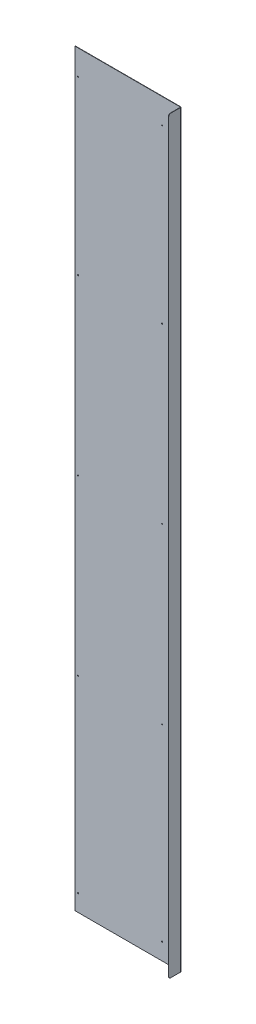
ISO-10303-21;
HEADER;
FILE_DESCRIPTION(('STEP AP214'),'2;1');
FILE_NAME('part.step','',(''),(''),'','','');
FILE_SCHEMA(('AUTOMOTIVE_DESIGN { 1 0 10303 214 1 1 1 1 }'));
ENDSEC;
DATA;
#1=APPLICATION_CONTEXT('core data for automotive mechanical design processes');
#2=APPLICATION_PROTOCOL_DEFINITION('international standard','automotive_design',2000,#1);
#3=PRODUCT_CONTEXT('',#1,'mechanical');
#4=PRODUCT('Part','Part','',(#3));
#5=PRODUCT_RELATED_PRODUCT_CATEGORY('part','',(#4));
#6=PRODUCT_DEFINITION_FORMATION('','',#4);
#7=PRODUCT_DEFINITION_CONTEXT('part definition',#1,'design');
#8=PRODUCT_DEFINITION('design','',#6,#7);
#9=PRODUCT_DEFINITION_SHAPE('','',#8);
#10=(LENGTH_UNIT() NAMED_UNIT(*) SI_UNIT(.MILLI.,.METRE.));
#11=(NAMED_UNIT(*) PLANE_ANGLE_UNIT() SI_UNIT($,.RADIAN.));
#12=(NAMED_UNIT(*) SI_UNIT($,.STERADIAN.) SOLID_ANGLE_UNIT());
#13=UNCERTAINTY_MEASURE_WITH_UNIT(LENGTH_MEASURE(1.E-05),#10,'distance_accuracy_value','');
#14=(GEOMETRIC_REPRESENTATION_CONTEXT(3) GLOBAL_UNCERTAINTY_ASSIGNED_CONTEXT((#13)) GLOBAL_UNIT_ASSIGNED_CONTEXT((#10,
#11,#12)) REPRESENTATION_CONTEXT('',''));
#15=CARTESIAN_POINT('',(0.,0.,0.));
#16=DIRECTION('',(0.,0.,1.));
#17=DIRECTION('',(1.,0.,0.));
#18=AXIS2_PLACEMENT_3D('',#15,#16,#17);
#19=CARTESIAN_POINT('',(312.642213333332,-25.,408.));
#20=DIRECTION('',(-1.,0.,0.));
#21=DIRECTION('',(0.,1.,0.));
#22=AXIS2_PLACEMENT_3D('',#19,#20,#21);
#23=PLANE('',#22);
#24=DIRECTION('',(0.,-1.,0.));
#25=VECTOR('',#24,1.);
#26=CARTESIAN_POINT('',(312.642213333332,0.,0.));
#27=LINE('',#26,#25);
#28=CARTESIAN_POINT('',(312.642213333332,1790.7,0.));
#29=VERTEX_POINT('',#28);
#30=CARTESIAN_POINT('',(312.642213333332,0.,0.));
#31=VERTEX_POINT('',#30);
#32=EDGE_CURVE('E240',#29,#31,#27,.T.);
#33=ORIENTED_EDGE('',*,*,#32,.F.);
#34=DIRECTION('',(0.,0.,1.));
#35=VECTOR('',#34,1.);
#36=CARTESIAN_POINT('',(312.642213333332,1790.7,-0.8128));
#37=LINE('',#36,#35);
#38=CARTESIAN_POINT('',(312.642213333332,1790.7,-0.812800000000219));
#39=VERTEX_POINT('',#38);
#40=EDGE_CURVE('E290',#39,#29,#37,.T.);
#41=ORIENTED_EDGE('',*,*,#40,.F.);
#42=DIRECTION('',(0.,-1.,0.));
#43=VECTOR('',#42,1.);
#44=CARTESIAN_POINT('',(312.642213333332,0.,-0.8128));
#45=LINE('',#44,#43);
#46=CARTESIAN_POINT('',(312.642213333332,0.,-0.8128));
#47=VERTEX_POINT('',#46);
#48=EDGE_CURVE('E555',#39,#47,#45,.T.);
#49=ORIENTED_EDGE('',*,*,#48,.T.);
#50=DIRECTION('',(0.,0.,-1.));
#51=VECTOR('',#50,1.);
#52=CARTESIAN_POINT('',(312.642213333332,0.,-0.8128));
#53=LINE('',#52,#51);
#54=EDGE_CURVE('E283',#31,#47,#53,.T.);
#55=ORIENTED_EDGE('',*,*,#54,.F.);
#56=EDGE_LOOP('',(#33,#41,#49,#55));
#57=FACE_BOUND('',#56,.T.);
#58=ADVANCED_FACE('F17',(#57),#23,.T.);
#59=CARTESIAN_POINT('',(520.725546663332,40.,0.));
#60=DIRECTION('',(0.,0.,1.));
#61=DIRECTION('',(1.,0.,0.));
#62=AXIS2_PLACEMENT_3D('',#59,#60,#61);
#63=CYLINDRICAL_SURFACE('',#62,1.21919999999998);
#64=CARTESIAN_POINT('',(520.725546663332,40.,0.));
#65=DIRECTION('',(0.,0.,1.));
#66=DIRECTION('',(1.,0.,0.));
#67=AXIS2_PLACEMENT_3D('',#64,#65,#66);
#68=CIRCLE('',#67,1.21919999999998);
#69=CARTESIAN_POINT('',(521.944746663332,40.,0.));
#70=VERTEX_POINT('',#69);
#71=EDGE_CURVE('E282',#70,#70,#68,.T.);
#72=ORIENTED_EDGE('',*,*,#71,.T.);
#73=EDGE_LOOP('',(#72));
#74=FACE_BOUND('',#73,.T.);
#75=CARTESIAN_POINT('',(520.725546663332,40.,-0.8128));
#76=DIRECTION('',(0.,0.,1.));
#77=DIRECTION('',(1.,0.,0.));
#78=AXIS2_PLACEMENT_3D('',#75,#76,#77);
#79=CIRCLE('',#78,1.21919999999998);
#80=CARTESIAN_POINT('',(521.944746663332,40.,-0.8128));
#81=VERTEX_POINT('',#80);
#82=EDGE_CURVE('E235',#81,#81,#79,.T.);
#83=ORIENTED_EDGE('',*,*,#82,.F.);
#84=EDGE_LOOP('',(#83));
#85=FACE_BOUND('',#84,.T.);
#86=ADVANCED_FACE('F852',(#74,#85),#63,.F.);
#87=CARTESIAN_POINT('',(319.642213329999,40.,0.));
#88=DIRECTION('',(0.,0.,1.));
#89=DIRECTION('',(1.,0.,0.));
#90=AXIS2_PLACEMENT_3D('',#87,#88,#89);
#91=CYLINDRICAL_SURFACE('',#90,1.21919999999998);
#92=CARTESIAN_POINT('',(319.642213329999,40.,0.));
#93=DIRECTION('',(0.,0.,1.));
#94=DIRECTION('',(1.,0.,0.));
#95=AXIS2_PLACEMENT_3D('',#92,#93,#94);
#96=CIRCLE('',#95,1.21919999999998);
#97=CARTESIAN_POINT('',(320.861413329999,40.,0.));
#98=VERTEX_POINT('',#97);
#99=EDGE_CURVE('E279',#98,#98,#96,.T.);
#100=ORIENTED_EDGE('',*,*,#99,.T.);
#101=EDGE_LOOP('',(#100));
#102=FACE_BOUND('',#101,.T.);
#103=CARTESIAN_POINT('',(319.642213329999,40.,-0.8128));
#104=DIRECTION('',(0.,0.,1.));
#105=DIRECTION('',(1.,0.,0.));
#106=AXIS2_PLACEMENT_3D('',#103,#104,#105);
#107=CIRCLE('',#106,1.21919999999998);
#108=CARTESIAN_POINT('',(320.861413329999,40.,-0.8128));
#109=VERTEX_POINT('',#108);
#110=EDGE_CURVE('E213',#109,#109,#107,.T.);
#111=ORIENTED_EDGE('',*,*,#110,.F.);
#112=EDGE_LOOP('',(#111));
#113=FACE_BOUND('',#112,.T.);
#114=ADVANCED_FACE('F843',(#102,#113),#91,.F.);
#115=CARTESIAN_POINT('',(319.642213329999,490.,0.));
#116=DIRECTION('',(0.,0.,1.));
#117=DIRECTION('',(1.,0.,0.));
#118=AXIS2_PLACEMENT_3D('',#115,#116,#117);
#119=CYLINDRICAL_SURFACE('',#118,1.21919999999998);
#120=CARTESIAN_POINT('',(319.642213329999,490.,0.));
#121=DIRECTION('',(0.,0.,1.));
#122=DIRECTION('',(1.,0.,0.));
#123=AXIS2_PLACEMENT_3D('',#120,#121,#122);
#124=CIRCLE('',#123,1.21919999999998);
#125=CARTESIAN_POINT('',(320.861413329999,490.,0.));
#126=VERTEX_POINT('',#125);
#127=EDGE_CURVE('E276',#126,#126,#124,.T.);
#128=ORIENTED_EDGE('',*,*,#127,.T.);
#129=EDGE_LOOP('',(#128));
#130=FACE_BOUND('',#129,.T.);
#131=CARTESIAN_POINT('',(319.642213329999,490.,-0.8128));
#132=DIRECTION('',(0.,0.,1.));
#133=DIRECTION('',(1.,0.,0.));
#134=AXIS2_PLACEMENT_3D('',#131,#132,#133);
#135=CIRCLE('',#134,1.21919999999998);
#136=CARTESIAN_POINT('',(320.861413329999,490.,-0.8128));
#137=VERTEX_POINT('',#136);
#138=EDGE_CURVE('E205',#137,#137,#135,.T.);
#139=ORIENTED_EDGE('',*,*,#138,.F.);
#140=EDGE_LOOP('',(#139));
#141=FACE_BOUND('',#140,.T.);
#142=ADVANCED_FACE('F834',(#130,#141),#119,.F.);
#143=CARTESIAN_POINT('',(520.725546663332,490.,0.));
#144=DIRECTION('',(0.,0.,1.));
#145=DIRECTION('',(1.,0.,0.));
#146=AXIS2_PLACEMENT_3D('',#143,#144,#145);
#147=CYLINDRICAL_SURFACE('',#146,1.21919999999998);
#148=CARTESIAN_POINT('',(520.725546663332,490.,0.));
#149=DIRECTION('',(0.,0.,1.));
#150=DIRECTION('',(1.,0.,0.));
#151=AXIS2_PLACEMENT_3D('',#148,#149,#150);
#152=CIRCLE('',#151,1.21919999999998);
#153=CARTESIAN_POINT('',(521.944746663332,490.,0.));
#154=VERTEX_POINT('',#153);
#155=EDGE_CURVE('E273',#154,#154,#152,.T.);
#156=ORIENTED_EDGE('',*,*,#155,.T.);
#157=EDGE_LOOP('',(#156));
#158=FACE_BOUND('',#157,.T.);
#159=CARTESIAN_POINT('',(520.725546663332,490.,-0.8128));
#160=DIRECTION('',(0.,0.,1.));
#161=DIRECTION('',(1.,0.,0.));
#162=AXIS2_PLACEMENT_3D('',#159,#160,#161);
#163=CIRCLE('',#162,1.21919999999998);
#164=CARTESIAN_POINT('',(521.944746663332,490.,-0.8128));
#165=VERTEX_POINT('',#164);
#166=EDGE_CURVE('E200',#165,#165,#163,.T.);
#167=ORIENTED_EDGE('',*,*,#166,.F.);
#168=EDGE_LOOP('',(#167));
#169=FACE_BOUND('',#168,.T.);
#170=ADVANCED_FACE('F825',(#158,#169),#147,.F.);
#171=CARTESIAN_POINT('',(520.725546663332,905.,0.));
#172=DIRECTION('',(0.,0.,1.));
#173=DIRECTION('',(1.,0.,0.));
#174=AXIS2_PLACEMENT_3D('',#171,#172,#173);
#175=CYLINDRICAL_SURFACE('',#174,1.21919999999998);
#176=CARTESIAN_POINT('',(520.725546663332,905.,0.));
#177=DIRECTION('',(0.,0.,1.));
#178=DIRECTION('',(1.,0.,0.));
#179=AXIS2_PLACEMENT_3D('',#176,#177,#178);
#180=CIRCLE('',#179,1.21919999999998);
#181=CARTESIAN_POINT('',(521.944746663332,905.,0.));
#182=VERTEX_POINT('',#181);
#183=EDGE_CURVE('E270',#182,#182,#180,.T.);
#184=ORIENTED_EDGE('',*,*,#183,.T.);
#185=EDGE_LOOP('',(#184));
#186=FACE_BOUND('',#185,.T.);
#187=CARTESIAN_POINT('',(520.725546663332,905.,-0.8128));
#188=DIRECTION('',(0.,0.,1.));
#189=DIRECTION('',(1.,0.,0.));
#190=AXIS2_PLACEMENT_3D('',#187,#188,#189);
#191=CIRCLE('',#190,1.21919999999998);
#192=CARTESIAN_POINT('',(521.944746663332,905.,-0.8128));
#193=VERTEX_POINT('',#192);
#194=EDGE_CURVE('E206',#193,#193,#191,.T.);
#195=ORIENTED_EDGE('',*,*,#194,.F.);
#196=EDGE_LOOP('',(#195));
#197=FACE_BOUND('',#196,.T.);
#198=ADVANCED_FACE('F816',(#186,#197),#175,.F.);
#199=CARTESIAN_POINT('',(319.642213329999,905.,0.));
#200=DIRECTION('',(0.,0.,1.));
#201=DIRECTION('',(1.,0.,0.));
#202=AXIS2_PLACEMENT_3D('',#199,#200,#201);
#203=CYLINDRICAL_SURFACE('',#202,1.21919999999998);
#204=CARTESIAN_POINT('',(319.642213329999,905.,0.));
#205=DIRECTION('',(0.,0.,1.));
#206=DIRECTION('',(1.,0.,0.));
#207=AXIS2_PLACEMENT_3D('',#204,#205,#206);
#208=CIRCLE('',#207,1.21919999999998);
#209=CARTESIAN_POINT('',(320.861413329999,905.,0.));
#210=VERTEX_POINT('',#209);
#211=EDGE_CURVE('E267',#210,#210,#208,.T.);
#212=ORIENTED_EDGE('',*,*,#211,.T.);
#213=EDGE_LOOP('',(#212));
#214=FACE_BOUND('',#213,.T.);
#215=CARTESIAN_POINT('',(319.642213329999,905.,-0.8128));
#216=DIRECTION('',(0.,0.,1.));
#217=DIRECTION('',(1.,0.,0.));
#218=AXIS2_PLACEMENT_3D('',#215,#216,#217);
#219=CIRCLE('',#218,1.21919999999998);
#220=CARTESIAN_POINT('',(320.861413329999,905.,-0.8128));
#221=VERTEX_POINT('',#220);
#222=EDGE_CURVE('E215',#221,#221,#219,.T.);
#223=ORIENTED_EDGE('',*,*,#222,.F.);
#224=EDGE_LOOP('',(#223));
#225=FACE_BOUND('',#224,.T.);
#226=ADVANCED_FACE('F768',(#214,#225),#203,.F.);
#227=CARTESIAN_POINT('',(319.642213329999,1730.7,0.));
#228=DIRECTION('',(0.,0.,1.));
#229=DIRECTION('',(1.,0.,0.));
#230=AXIS2_PLACEMENT_3D('',#227,#228,#229);
#231=CYLINDRICAL_SURFACE('',#230,1.21919999999998);
#232=CARTESIAN_POINT('',(319.642213329999,1730.7,0.));
#233=DIRECTION('',(0.,0.,1.));
#234=DIRECTION('',(1.,0.,0.));
#235=AXIS2_PLACEMENT_3D('',#232,#233,#234);
#236=CIRCLE('',#235,1.21919999999998);
#237=CARTESIAN_POINT('',(320.861413329999,1730.7,0.));
#238=VERTEX_POINT('',#237);
#239=EDGE_CURVE('E264',#238,#238,#236,.T.);
#240=ORIENTED_EDGE('',*,*,#239,.T.);
#241=EDGE_LOOP('',(#240));
#242=FACE_BOUND('',#241,.T.);
#243=CARTESIAN_POINT('',(319.642213329999,1730.7,-0.8128));
#244=DIRECTION('',(0.,0.,1.));
#245=DIRECTION('',(1.,0.,0.));
#246=AXIS2_PLACEMENT_3D('',#243,#244,#245);
#247=CIRCLE('',#246,1.21919999999998);
#248=CARTESIAN_POINT('',(320.861413329999,1730.7,-0.8128));
#249=VERTEX_POINT('',#248);
#250=EDGE_CURVE('E232',#249,#249,#247,.T.);
#251=ORIENTED_EDGE('',*,*,#250,.F.);
#252=EDGE_LOOP('',(#251));
#253=FACE_BOUND('',#252,.T.);
#254=ADVANCED_FACE('F763',(#242,#253),#231,.F.);
#255=CARTESIAN_POINT('',(520.725546663332,1730.7,0.));
#256=DIRECTION('',(0.,0.,1.));
#257=DIRECTION('',(1.,0.,0.));
#258=AXIS2_PLACEMENT_3D('',#255,#256,#257);
#259=CYLINDRICAL_SURFACE('',#258,1.21919999999998);
#260=CARTESIAN_POINT('',(520.725546663332,1730.7,0.));
#261=DIRECTION('',(0.,0.,1.));
#262=DIRECTION('',(1.,0.,0.));
#263=AXIS2_PLACEMENT_3D('',#260,#261,#262);
#264=CIRCLE('',#263,1.21919999999998);
#265=CARTESIAN_POINT('',(521.944746663332,1730.7,0.));
#266=VERTEX_POINT('',#265);
#267=EDGE_CURVE('E261',#266,#266,#264,.T.);
#268=ORIENTED_EDGE('',*,*,#267,.T.);
#269=EDGE_LOOP('',(#268));
#270=FACE_BOUND('',#269,.T.);
#271=CARTESIAN_POINT('',(520.725546663332,1730.7,-0.8128));
#272=DIRECTION('',(0.,0.,1.));
#273=DIRECTION('',(1.,0.,0.));
#274=AXIS2_PLACEMENT_3D('',#271,#272,#273);
#275=CIRCLE('',#274,1.21919999999998);
#276=CARTESIAN_POINT('',(521.944746663332,1730.7,-0.8128));
#277=VERTEX_POINT('',#276);
#278=EDGE_CURVE('E224',#277,#277,#275,.T.);
#279=ORIENTED_EDGE('',*,*,#278,.F.);
#280=EDGE_LOOP('',(#279));
#281=FACE_BOUND('',#280,.T.);
#282=ADVANCED_FACE('F767',(#270,#281),#259,.F.);
#283=CARTESIAN_POINT('',(319.642213329999,1320.,0.));
#284=DIRECTION('',(0.,0.,1.));
#285=DIRECTION('',(1.,0.,0.));
#286=AXIS2_PLACEMENT_3D('',#283,#284,#285);
#287=CYLINDRICAL_SURFACE('',#286,1.21919999999998);
#288=CARTESIAN_POINT('',(319.642213329999,1320.,0.));
#289=DIRECTION('',(0.,0.,1.));
#290=DIRECTION('',(1.,0.,0.));
#291=AXIS2_PLACEMENT_3D('',#288,#289,#290);
#292=CIRCLE('',#291,1.21919999999998);
#293=CARTESIAN_POINT('',(320.861413329999,1320.,0.));
#294=VERTEX_POINT('',#293);
#295=EDGE_CURVE('E258',#294,#294,#292,.T.);
#296=ORIENTED_EDGE('',*,*,#295,.T.);
#297=EDGE_LOOP('',(#296));
#298=FACE_BOUND('',#297,.T.);
#299=CARTESIAN_POINT('',(319.642213329999,1320.,-0.8128));
#300=DIRECTION('',(0.,0.,1.));
#301=DIRECTION('',(1.,0.,0.));
#302=AXIS2_PLACEMENT_3D('',#299,#300,#301);
#303=CIRCLE('',#302,1.21919999999998);
#304=CARTESIAN_POINT('',(320.861413329999,1320.,-0.8128));
#305=VERTEX_POINT('',#304);
#306=EDGE_CURVE('E221',#305,#305,#303,.T.);
#307=ORIENTED_EDGE('',*,*,#306,.F.);
#308=EDGE_LOOP('',(#307));
#309=FACE_BOUND('',#308,.T.);
#310=ADVANCED_FACE('F667',(#298,#309),#287,.F.);
#311=CARTESIAN_POINT('',(520.725546663332,1320.,0.));
#312=DIRECTION('',(0.,0.,1.));
#313=DIRECTION('',(1.,0.,0.));
#314=AXIS2_PLACEMENT_3D('',#311,#312,#313);
#315=CYLINDRICAL_SURFACE('',#314,1.21919999999998);
#316=CARTESIAN_POINT('',(520.725546663332,1320.,0.));
#317=DIRECTION('',(0.,0.,1.));
#318=DIRECTION('',(1.,0.,0.));
#319=AXIS2_PLACEMENT_3D('',#316,#317,#318);
#320=CIRCLE('',#319,1.21919999999998);
#321=CARTESIAN_POINT('',(521.944746663332,1320.,0.));
#322=VERTEX_POINT('',#321);
#323=EDGE_CURVE('E255',#322,#322,#320,.T.);
#324=ORIENTED_EDGE('',*,*,#323,.T.);
#325=EDGE_LOOP('',(#324));
#326=FACE_BOUND('',#325,.T.);
#327=CARTESIAN_POINT('',(520.725546663332,1320.,-0.8128));
#328=DIRECTION('',(0.,0.,1.));
#329=DIRECTION('',(1.,0.,0.));
#330=AXIS2_PLACEMENT_3D('',#327,#328,#329);
#331=CIRCLE('',#330,1.21919999999998);
#332=CARTESIAN_POINT('',(521.944746663332,1320.,-0.8128));
#333=VERTEX_POINT('',#332);
#334=EDGE_CURVE('E219',#333,#333,#331,.T.);
#335=ORIENTED_EDGE('',*,*,#334,.F.);
#336=EDGE_LOOP('',(#335));
#337=FACE_BOUND('',#336,.T.);
#338=ADVANCED_FACE('F662',(#326,#337),#315,.F.);
#339=CARTESIAN_POINT('',(565.6948,4.99999999999989,24.1872));
#340=DIRECTION('',(-1.,0.,0.));
#341=DIRECTION('',(0.,0.,1.));
#342=AXIS2_PLACEMENT_3D('',#339,#340,#341);
#343=CYLINDRICAL_SURFACE('',#342,5.);
#344=CARTESIAN_POINT('',(565.6948,4.99999999999989,24.1872));
#345=DIRECTION('',(1.,0.,0.));
#346=DIRECTION('',(0.,0.,1.));
#347=AXIS2_PLACEMENT_3D('',#344,#345,#346);
#348=CIRCLE('',#347,5.);
#349=CARTESIAN_POINT('',(565.6948,4.99999999999989,29.1872));
#350=VERTEX_POINT('',#349);
#351=CARTESIAN_POINT('',(565.6948,-1.13332653014918E-13,24.1872));
#352=VERTEX_POINT('',#351);
#353=EDGE_CURVE('E357',#350,#352,#348,.T.);
#354=ORIENTED_EDGE('',*,*,#353,.F.);
#355=DIRECTION('',(1.,0.,0.));
#356=VECTOR('',#355,1.);
#357=CARTESIAN_POINT('',(565.6948,4.99999999999989,29.1872));
#358=LINE('',#357,#356);
#359=CARTESIAN_POINT('',(564.882,4.99999999999989,29.1872));
#360=VERTEX_POINT('',#359);
#361=EDGE_CURVE('E11',#360,#350,#358,.T.);
#362=ORIENTED_EDGE('',*,*,#361,.F.);
#363=CARTESIAN_POINT('',(564.882,4.99999999999989,24.1872));
#364=DIRECTION('',(-1.,0.,0.));
#365=DIRECTION('',(0.,0.,1.));
#366=AXIS2_PLACEMENT_3D('',#363,#364,#365);
#367=CIRCLE('',#366,5.);
#368=CARTESIAN_POINT('',(564.882,-1.13483832320399E-13,24.1872));
#369=VERTEX_POINT('',#368);
#370=EDGE_CURVE('E341',#369,#360,#367,.T.);
#371=ORIENTED_EDGE('',*,*,#370,.F.);
#372=DIRECTION('',(-1.,0.,0.));
#373=VECTOR('',#372,1.);
#374=CARTESIAN_POINT('',(565.6948,-1.13332653014918E-13,24.1872));
#375=LINE('',#374,#373);
#376=EDGE_CURVE('E337',#352,#369,#375,.T.);
#377=ORIENTED_EDGE('',*,*,#376,.F.);
#378=EDGE_LOOP('',(#354,#362,#371,#377));
#379=FACE_BOUND('',#378,.T.);
#380=ADVANCED_FACE('F666',(#379),#343,.T.);
#381=CARTESIAN_POINT('',(565.6948,1785.7,24.1872));
#382=DIRECTION('',(-1.,0.,0.));
#383=DIRECTION('',(0.,0.,1.));
#384=AXIS2_PLACEMENT_3D('',#381,#382,#383);
#385=CYLINDRICAL_SURFACE('',#384,5.);
#386=CARTESIAN_POINT('',(565.6948,1785.7,24.1872));
#387=DIRECTION('',(1.,0.,0.));
#388=DIRECTION('',(0.,0.,1.));
#389=AXIS2_PLACEMENT_3D('',#386,#387,#388);
#390=CIRCLE('',#389,5.);
#391=CARTESIAN_POINT('',(565.6948,1790.7,24.1872));
#392=VERTEX_POINT('',#391);
#393=CARTESIAN_POINT('',(565.6948,1785.7,29.1872));
#394=VERTEX_POINT('',#393);
#395=EDGE_CURVE('E346',#392,#394,#390,.T.);
#396=ORIENTED_EDGE('',*,*,#395,.F.);
#397=DIRECTION('',(1.,0.,0.));
#398=VECTOR('',#397,1.);
#399=CARTESIAN_POINT('',(565.6948,1790.7,24.1872));
#400=LINE('',#399,#398);
#401=CARTESIAN_POINT('',(564.882,1790.7,24.1872));
#402=VERTEX_POINT('',#401);
#403=EDGE_CURVE('E326',#402,#392,#400,.T.);
#404=ORIENTED_EDGE('',*,*,#403,.F.);
#405=CARTESIAN_POINT('',(564.882,1785.7,24.1872));
#406=DIRECTION('',(-1.,0.,0.));
#407=DIRECTION('',(0.,0.,1.));
#408=AXIS2_PLACEMENT_3D('',#405,#406,#407);
#409=CIRCLE('',#408,5.);
#410=CARTESIAN_POINT('',(564.882,1785.7,29.1872));
#411=VERTEX_POINT('',#410);
#412=EDGE_CURVE('E338',#411,#402,#409,.T.);
#413=ORIENTED_EDGE('',*,*,#412,.F.);
#414=DIRECTION('',(-1.,0.,0.));
#415=VECTOR('',#414,1.);
#416=CARTESIAN_POINT('',(565.6948,1785.7,29.1872));
#417=LINE('',#416,#415);
#418=EDGE_CURVE('E25',#394,#411,#417,.T.);
#419=ORIENTED_EDGE('',*,*,#418,.F.);
#420=EDGE_LOOP('',(#396,#404,#413,#419));
#421=FACE_BOUND('',#420,.T.);
#422=ADVANCED_FACE('F691',(#421),#385,.T.);
#423=CARTESIAN_POINT('',(565.6948,-1.23922183440677E-13,29.1872));
#424=DIRECTION('',(0.,0.,-1.));
#425=DIRECTION('',(-1.,0.,0.));
#426=AXIS2_PLACEMENT_3D('',#423,#424,#425);
#427=PLANE('',#426);
#428=DIRECTION('',(0.,-1.,0.));
#429=VECTOR('',#428,1.);
#430=CARTESIAN_POINT('',(565.6948,-1.23922183440677E-13,29.1872));
#431=LINE('',#430,#429);
#432=EDGE_CURVE('E353',#394,#350,#431,.T.);
#433=ORIENTED_EDGE('',*,*,#432,.F.);
#434=ORIENTED_EDGE('',*,*,#418,.T.);
#435=DIRECTION('',(0.,-1.,0.));
#436=VECTOR('',#435,1.);
#437=CARTESIAN_POINT('',(564.882,-1.24073362746158E-13,29.1872));
#438=LINE('',#437,#436);
#439=EDGE_CURVE('E342',#411,#360,#438,.T.);
#440=ORIENTED_EDGE('',*,*,#439,.T.);
#441=ORIENTED_EDGE('',*,*,#361,.T.);
#442=EDGE_LOOP('',(#433,#434,#440,#441));
#443=FACE_BOUND('',#442,.T.);
#444=ADVANCED_FACE('F695',(#443),#427,.F.);
#445=CARTESIAN_POINT('',(564.882,1.05067013334948E-13,-2.14869875355056E-12));
#446=DIRECTION('',(-1.,0.,0.));
#447=DIRECTION('',(0.,1.,0.));
#448=AXIS2_PLACEMENT_3D('',#445,#446,#447);
#449=PLANE('',#448);
#450=ORIENTED_EDGE('',*,*,#439,.F.);
#451=ORIENTED_EDGE('',*,*,#412,.T.);
#452=DIRECTION('',(0.,0.,1.));
#453=VECTOR('',#452,1.);
#454=CARTESIAN_POINT('',(564.882,1790.7,29.1872));
#455=LINE('',#454,#453);
#456=CARTESIAN_POINT('',(564.882,1790.7,0.812799999999947));
#457=VERTEX_POINT('',#456);
#458=EDGE_CURVE('E322',#457,#402,#455,.T.);
#459=ORIENTED_EDGE('',*,*,#458,.F.);
#460=DIRECTION('',(0.,1.,0.));
#461=VECTOR('',#460,1.);
#462=CARTESIAN_POINT('',(564.882,0.,0.812799999999947));
#463=LINE('',#462,#461);
#464=CARTESIAN_POINT('',(564.882,0.,0.812799999999947));
#465=VERTEX_POINT('',#464);
#466=EDGE_CURVE('E318',#465,#457,#463,.T.);
#467=ORIENTED_EDGE('',*,*,#466,.F.);
#468=DIRECTION('',(0.,0.,-1.));
#469=VECTOR('',#468,1.);
#470=CARTESIAN_POINT('',(564.882,0.,0.));
#471=LINE('',#470,#469);
#472=EDGE_CURVE('E343',#369,#465,#471,.T.);
#473=ORIENTED_EDGE('',*,*,#472,.F.);
#474=ORIENTED_EDGE('',*,*,#370,.T.);
#475=EDGE_LOOP('',(#450,#451,#459,#467,#473,#474));
#476=FACE_BOUND('',#475,.T.);
#477=ADVANCED_FACE('F704',(#476),#449,.T.);
#478=CARTESIAN_POINT('',(565.6948,1.05218192640429E-13,-2.15153662958277E-12));
#479=DIRECTION('',(-1.,0.,0.));
#480=DIRECTION('',(0.,1.,0.));
#481=AXIS2_PLACEMENT_3D('',#478,#479,#480);
#482=PLANE('',#481);
#483=DIRECTION('',(0.,0.,1.));
#484=VECTOR('',#483,1.);
#485=CARTESIAN_POINT('',(565.6948,1790.7,29.1872));
#486=LINE('',#485,#484);
#487=CARTESIAN_POINT('',(565.6948,1790.7,0.812799999999944));
#488=VERTEX_POINT('',#487);
#489=EDGE_CURVE('E330',#488,#392,#486,.T.);
#490=ORIENTED_EDGE('',*,*,#489,.T.);
#491=ORIENTED_EDGE('',*,*,#395,.T.);
#492=ORIENTED_EDGE('',*,*,#432,.T.);
#493=ORIENTED_EDGE('',*,*,#353,.T.);
#494=DIRECTION('',(0.,0.,-1.));
#495=VECTOR('',#494,1.);
#496=CARTESIAN_POINT('',(565.6948,0.,0.));
#497=LINE('',#496,#495);
#498=CARTESIAN_POINT('',(565.6948,0.,0.812799999999944));
#499=VERTEX_POINT('',#498);
#500=EDGE_CURVE('E334',#352,#499,#497,.T.);
#501=ORIENTED_EDGE('',*,*,#500,.T.);
#502=DIRECTION('',(0.,-1.,0.));
#503=VECTOR('',#502,1.);
#504=CARTESIAN_POINT('',(565.6948,1.05218192640429E-13,0.812799999999944));
#505=LINE('',#504,#503);
#506=EDGE_CURVE('E308',#488,#499,#505,.T.);
#507=ORIENTED_EDGE('',*,*,#506,.F.);
#508=EDGE_LOOP('',(#490,#491,#492,#493,#501,#507));
#509=FACE_BOUND('',#508,.T.);
#510=ADVANCED_FACE('F712',(#509),#482,.F.);
#511=CARTESIAN_POINT('',(565.6948,0.,0.));
#512=DIRECTION('',(0.,1.,0.));
#513=DIRECTION('',(0.,0.,-1.));
#514=AXIS2_PLACEMENT_3D('',#511,#512,#513);
#515=PLANE('',#514);
#516=ORIENTED_EDGE('',*,*,#500,.F.);
#517=ORIENTED_EDGE('',*,*,#376,.T.);
#518=ORIENTED_EDGE('',*,*,#472,.T.);
#519=DIRECTION('',(1.,0.,0.));
#520=VECTOR('',#519,1.);
#521=CARTESIAN_POINT('',(564.882,0.,0.812799999999947));
#522=LINE('',#521,#520);
#523=EDGE_CURVE('E297',#465,#499,#522,.T.);
#524=ORIENTED_EDGE('',*,*,#523,.T.);
#525=EDGE_LOOP('',(#516,#517,#518,#524));
#526=FACE_BOUND('',#525,.T.);
#527=ADVANCED_FACE('F738',(#526),#515,.F.);
#528=CARTESIAN_POINT('',(565.6948,1790.7,29.1872));
#529=DIRECTION('',(0.,-1.,0.));
#530=DIRECTION('',(0.,0.,-1.));
#531=AXIS2_PLACEMENT_3D('',#528,#529,#530);
#532=PLANE('',#531);
#533=ORIENTED_EDGE('',*,*,#458,.T.);
#534=ORIENTED_EDGE('',*,*,#403,.T.);
#535=ORIENTED_EDGE('',*,*,#489,.F.);
#536=DIRECTION('',(1.,0.,0.));
#537=VECTOR('',#536,1.);
#538=CARTESIAN_POINT('',(564.882,1790.7,0.812799999999947));
#539=LINE('',#538,#537);
#540=EDGE_CURVE('E228',#457,#488,#539,.T.);
#541=ORIENTED_EDGE('',*,*,#540,.F.);
#542=EDGE_LOOP('',(#533,#534,#535,#541));
#543=FACE_BOUND('',#542,.T.);
#544=ADVANCED_FACE('F723',(#543),#532,.F.);
#545=CARTESIAN_POINT('',(564.0692,1790.7,0.81279999999995));
#546=DIRECTION('',(0.,1.,0.));
#547=DIRECTION('',(1.,0.,0.));
#548=AXIS2_PLACEMENT_3D('',#545,#546,#547);
#549=CYLINDRICAL_SURFACE('',#548,0.812800000000169);
#550=DIRECTION('',(0.,-1.,0.));
#551=VECTOR('',#550,1.);
#552=CARTESIAN_POINT('',(564.0692,1790.7,-2.19008838842072E-13));
#553=LINE('',#552,#551);
#554=CARTESIAN_POINT('',(564.0692,1790.7,0.));
#555=VERTEX_POINT('',#554);
#556=CARTESIAN_POINT('',(564.0692,0.,-2.19008838842072E-13));
#557=VERTEX_POINT('',#556);
#558=EDGE_CURVE('E251',#555,#557,#553,.T.);
#559=ORIENTED_EDGE('',*,*,#558,.T.);
#560=CARTESIAN_POINT('',(564.0692,0.,0.81279999999995));
#561=DIRECTION('',(0.,-1.,0.));
#562=DIRECTION('',(0.,0.,1.));
#563=AXIS2_PLACEMENT_3D('',#560,#561,#562);
#564=CIRCLE('',#563,0.812800000000169);
#565=EDGE_CURVE('E301',#557,#465,#564,.T.);
#566=ORIENTED_EDGE('',*,*,#565,.T.);
#567=ORIENTED_EDGE('',*,*,#466,.T.);
#568=CARTESIAN_POINT('',(564.0692,1790.7,0.81279999999995));
#569=DIRECTION('',(0.,1.,0.));
#570=DIRECTION('',(0.,0.,1.));
#571=AXIS2_PLACEMENT_3D('',#568,#569,#570);
#572=CIRCLE('',#571,0.812800000000169);
#573=EDGE_CURVE('E225',#457,#555,#572,.T.);
#574=ORIENTED_EDGE('',*,*,#573,.T.);
#575=EDGE_LOOP('',(#559,#566,#567,#574));
#576=FACE_BOUND('',#575,.T.);
#577=ADVANCED_FACE('F718',(#576),#549,.F.);
#578=CARTESIAN_POINT('',(564.0692,1790.7,0.81279999999995));
#579=DIRECTION('',(0.,1.,0.));
#580=DIRECTION('',(1.,0.,0.));
#581=AXIS2_PLACEMENT_3D('',#578,#579,#580);
#582=CYLINDRICAL_SURFACE('',#581,1.62560000000011);
#583=DIRECTION('',(0.,-1.,0.));
#584=VECTOR('',#583,1.);
#585=CARTESIAN_POINT('',(564.0692,1790.7,-0.812800000000219));
#586=LINE('',#585,#584);
#587=CARTESIAN_POINT('',(564.0692,1790.7,-0.812800000000219));
#588=VERTEX_POINT('',#587);
#589=CARTESIAN_POINT('',(564.0692,0.,-0.8128));
#590=VERTEX_POINT('',#589);
#591=EDGE_CURVE('E562',#588,#590,#586,.T.);
#592=ORIENTED_EDGE('',*,*,#591,.F.);
#593=CARTESIAN_POINT('',(564.0692,1790.7,0.81279999999995));
#594=DIRECTION('',(0.,1.,0.));
#595=DIRECTION('',(0.,0.,1.));
#596=AXIS2_PLACEMENT_3D('',#593,#594,#595);
#597=CIRCLE('',#596,1.62560000000017);
#598=EDGE_CURVE('E305',#488,#588,#597,.T.);
#599=ORIENTED_EDGE('',*,*,#598,.F.);
#600=ORIENTED_EDGE('',*,*,#506,.T.);
#601=CARTESIAN_POINT('',(564.0692,0.,0.81279999999995));
#602=DIRECTION('',(0.,-1.,0.));
#603=DIRECTION('',(0.,0.,1.));
#604=AXIS2_PLACEMENT_3D('',#601,#602,#603);
#605=CIRCLE('',#604,1.62560000000017);
#606=EDGE_CURVE('E229',#590,#499,#605,.T.);
#607=ORIENTED_EDGE('',*,*,#606,.F.);
#608=EDGE_LOOP('',(#592,#599,#600,#607));
#609=FACE_BOUND('',#608,.T.);
#610=ADVANCED_FACE('F722',(#609),#582,.T.);
#611=CARTESIAN_POINT('',(564.0692,1790.7,0.81279999999995));
#612=DIRECTION('',(0.,-1.,0.));
#613=DIRECTION('',(0.,0.,-1.));
#614=AXIS2_PLACEMENT_3D('',#611,#612,#613);
#615=PLANE('',#614);
#616=ORIENTED_EDGE('',*,*,#573,.F.);
#617=ORIENTED_EDGE('',*,*,#540,.T.);
#618=ORIENTED_EDGE('',*,*,#598,.T.);
#619=DIRECTION('',(-2.7318479936637E-13,0.,-1.));
#620=VECTOR('',#619,1.);
#621=CARTESIAN_POINT('',(564.0692,1790.7,-2.19008838842072E-13));
#622=LINE('',#621,#620);
#623=EDGE_CURVE('E293',#555,#588,#622,.T.);
#624=ORIENTED_EDGE('',*,*,#623,.F.);
#625=EDGE_LOOP('',(#616,#617,#618,#624));
#626=FACE_BOUND('',#625,.T.);
#627=ADVANCED_FACE('F732',(#626),#615,.F.);
#628=CARTESIAN_POINT('',(564.0692,0.,0.81279999999995));
#629=DIRECTION('',(0.,-1.,0.));
#630=DIRECTION('',(0.,0.,-1.));
#631=AXIS2_PLACEMENT_3D('',#628,#629,#630);
#632=PLANE('',#631);
#633=ORIENTED_EDGE('',*,*,#523,.F.);
#634=ORIENTED_EDGE('',*,*,#565,.F.);
#635=DIRECTION('',(-2.7318479936637E-13,0.,-1.));
#636=VECTOR('',#635,1.);
#637=CARTESIAN_POINT('',(564.0692,0.,-2.19008838842072E-13));
#638=LINE('',#637,#636);
#639=EDGE_CURVE('E286',#557,#590,#638,.T.);
#640=ORIENTED_EDGE('',*,*,#639,.T.);
#641=ORIENTED_EDGE('',*,*,#606,.T.);
#642=EDGE_LOOP('',(#633,#634,#640,#641));
#643=FACE_BOUND('',#642,.T.);
#644=ADVANCED_FACE('F685',(#643),#632,.T.);
#645=CARTESIAN_POINT('',(-5.55111512312578E-13,1790.7,-0.8128));
#646=DIRECTION('',(0.,1.,0.));
#647=DIRECTION('',(1.,0.,0.));
#648=AXIS2_PLACEMENT_3D('',#645,#646,#647);
#649=PLANE('',#648);
#650=DIRECTION('',(-1.,0.,0.));
#651=VECTOR('',#650,1.);
#652=CARTESIAN_POINT('',(-5.55111512312578E-13,1790.7,-0.8128));
#653=LINE('',#652,#651);
#654=EDGE_CURVE('E558',#588,#39,#653,.T.);
#655=ORIENTED_EDGE('',*,*,#654,.T.);
#656=ORIENTED_EDGE('',*,*,#40,.T.);
#657=DIRECTION('',(-1.,0.,0.));
#658=VECTOR('',#657,1.);
#659=CARTESIAN_POINT('',(-5.55111512312578E-13,1790.7,0.));
#660=LINE('',#659,#658);
#661=EDGE_CURVE('E236',#555,#29,#660,.T.);
#662=ORIENTED_EDGE('',*,*,#661,.F.);
#663=ORIENTED_EDGE('',*,*,#623,.T.);
#664=EDGE_LOOP('',(#655,#656,#662,#663));
#665=FACE_BOUND('',#664,.T.);
#666=ADVANCED_FACE('F676',(#665),#649,.T.);
#667=CARTESIAN_POINT('',(0.,0.,-0.8128));
#668=DIRECTION('',(0.,-1.,0.));
#669=DIRECTION('',(-1.,0.,0.));
#670=AXIS2_PLACEMENT_3D('',#667,#668,#669);
#671=PLANE('',#670);
#672=DIRECTION('',(1.,0.,0.));
#673=VECTOR('',#672,1.);
#674=CARTESIAN_POINT('',(0.,0.,0.));
#675=LINE('',#674,#673);
#676=EDGE_CURVE('E247',#31,#557,#675,.T.);
#677=ORIENTED_EDGE('',*,*,#676,.F.);
#678=ORIENTED_EDGE('',*,*,#54,.T.);
#679=DIRECTION('',(1.,0.,0.));
#680=VECTOR('',#679,1.);
#681=CARTESIAN_POINT('',(0.,0.,-0.8128));
#682=LINE('',#681,#680);
#683=EDGE_CURVE('E570',#47,#590,#682,.T.);
#684=ORIENTED_EDGE('',*,*,#683,.T.);
#685=ORIENTED_EDGE('',*,*,#639,.F.);
#686=EDGE_LOOP('',(#677,#678,#684,#685));
#687=FACE_BOUND('',#686,.T.);
#688=ADVANCED_FACE('F656',(#687),#671,.T.);
#689=CARTESIAN_POINT('',(0.,0.,0.));
#690=DIRECTION('',(0.,0.,1.));
#691=DIRECTION('',(1.,0.,0.));
#692=AXIS2_PLACEMENT_3D('',#689,#690,#691);
#693=PLANE('',#692);
#694=ORIENTED_EDGE('',*,*,#71,.F.);
#695=EDGE_LOOP('',(#694));
#696=FACE_BOUND('',#695,.T.);
#697=ORIENTED_EDGE('',*,*,#99,.F.);
#698=EDGE_LOOP('',(#697));
#699=FACE_BOUND('',#698,.T.);
#700=ORIENTED_EDGE('',*,*,#127,.F.);
#701=EDGE_LOOP('',(#700));
#702=FACE_BOUND('',#701,.T.);
#703=ORIENTED_EDGE('',*,*,#155,.F.);
#704=EDGE_LOOP('',(#703));
#705=FACE_BOUND('',#704,.T.);
#706=ORIENTED_EDGE('',*,*,#183,.F.);
#707=EDGE_LOOP('',(#706));
#708=FACE_BOUND('',#707,.T.);
#709=ORIENTED_EDGE('',*,*,#211,.F.);
#710=EDGE_LOOP('',(#709));
#711=FACE_BOUND('',#710,.T.);
#712=ORIENTED_EDGE('',*,*,#239,.F.);
#713=EDGE_LOOP('',(#712));
#714=FACE_BOUND('',#713,.T.);
#715=ORIENTED_EDGE('',*,*,#267,.F.);
#716=EDGE_LOOP('',(#715));
#717=FACE_BOUND('',#716,.T.);
#718=ORIENTED_EDGE('',*,*,#295,.F.);
#719=EDGE_LOOP('',(#718));
#720=FACE_BOUND('',#719,.T.);
#721=ORIENTED_EDGE('',*,*,#323,.F.);
#722=EDGE_LOOP('',(#721));
#723=FACE_BOUND('',#722,.T.);
#724=ORIENTED_EDGE('',*,*,#661,.T.);
#725=ORIENTED_EDGE('',*,*,#32,.T.);
#726=ORIENTED_EDGE('',*,*,#676,.T.);
#727=ORIENTED_EDGE('',*,*,#558,.F.);
#728=EDGE_LOOP('',(#724,#725,#726,#727));
#729=FACE_BOUND('',#728,.T.);
#730=ADVANCED_FACE('F648',(#696,#699,#702,#705,#708,#711,#714,#717,#720,#723,#729),#693,.T.);
#731=CARTESIAN_POINT('',(0.,0.,-0.8128));
#732=DIRECTION('',(0.,0.,1.));
#733=DIRECTION('',(1.,0.,0.));
#734=AXIS2_PLACEMENT_3D('',#731,#732,#733);
#735=PLANE('',#734);
#736=ORIENTED_EDGE('',*,*,#82,.T.);
#737=EDGE_LOOP('',(#736));
#738=FACE_BOUND('',#737,.T.);
#739=ORIENTED_EDGE('',*,*,#110,.T.);
#740=EDGE_LOOP('',(#739));
#741=FACE_BOUND('',#740,.T.);
#742=ORIENTED_EDGE('',*,*,#138,.T.);
#743=EDGE_LOOP('',(#742));
#744=FACE_BOUND('',#743,.T.);
#745=ORIENTED_EDGE('',*,*,#166,.T.);
#746=EDGE_LOOP('',(#745));
#747=FACE_BOUND('',#746,.T.);
#748=ORIENTED_EDGE('',*,*,#194,.T.);
#749=EDGE_LOOP('',(#748));
#750=FACE_BOUND('',#749,.T.);
#751=ORIENTED_EDGE('',*,*,#222,.T.);
#752=EDGE_LOOP('',(#751));
#753=FACE_BOUND('',#752,.T.);
#754=ORIENTED_EDGE('',*,*,#250,.T.);
#755=EDGE_LOOP('',(#754));
#756=FACE_BOUND('',#755,.T.);
#757=ORIENTED_EDGE('',*,*,#278,.T.);
#758=EDGE_LOOP('',(#757));
#759=FACE_BOUND('',#758,.T.);
#760=ORIENTED_EDGE('',*,*,#306,.T.);
#761=EDGE_LOOP('',(#760));
#762=FACE_BOUND('',#761,.T.);
#763=ORIENTED_EDGE('',*,*,#334,.T.);
#764=EDGE_LOOP('',(#763));
#765=FACE_BOUND('',#764,.T.);
#766=ORIENTED_EDGE('',*,*,#48,.F.);
#767=ORIENTED_EDGE('',*,*,#654,.F.);
#768=ORIENTED_EDGE('',*,*,#591,.T.);
#769=ORIENTED_EDGE('',*,*,#683,.F.);
#770=EDGE_LOOP('',(#766,#767,#768,#769));
#771=FACE_BOUND('',#770,.T.);
#772=ADVANCED_FACE('F201',(#738,#741,#744,#747,#750,#753,#756,#759,#762,#765,#771),#735,.F.);
#773=CLOSED_SHELL('',(#58,#86,#114,#142,#170,#198,#226,#254,#282,#310,#338,#380,#422,#444,#477,
#510,#527,#544,#577,#610,#627,#644,#666,#688,#730,#772));
#774=MANIFOLD_SOLID_BREP('B1',#773);
#775=ADVANCED_BREP_SHAPE_REPRESENTATION('',(#18,#774),#14);
#776=SHAPE_DEFINITION_REPRESENTATION(#9,#775);
ENDSEC;
END-ISO-10303-21;
